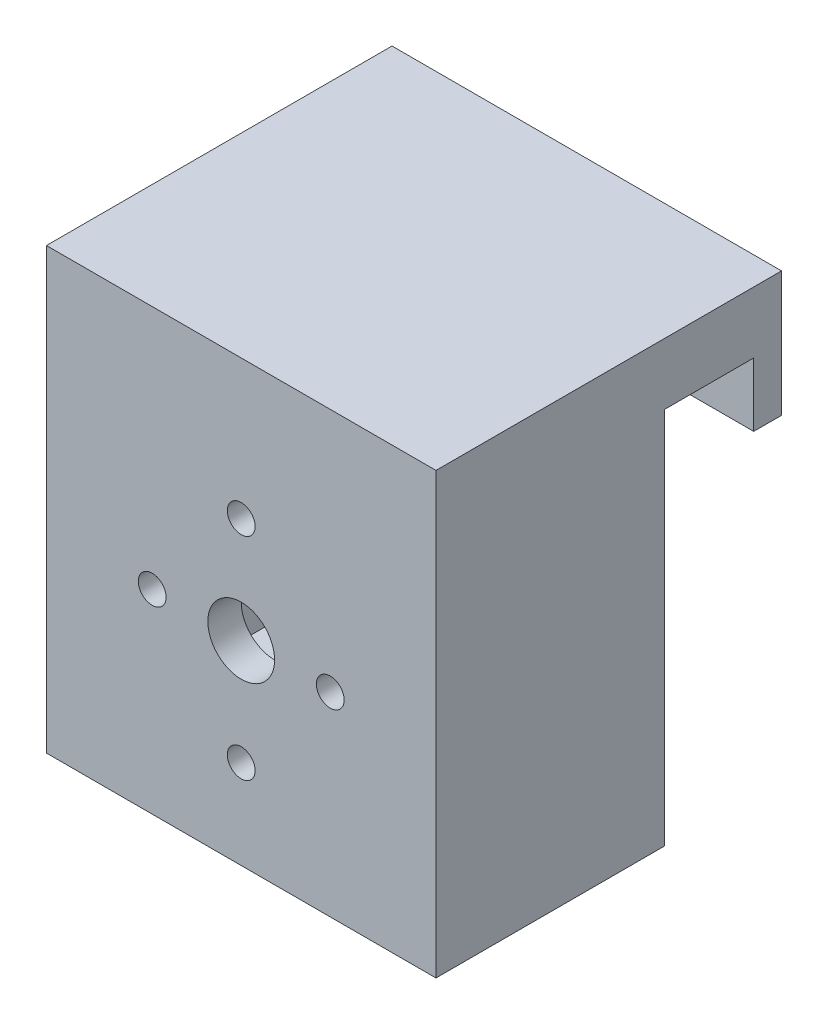
ISO-10303-21;
HEADER;
FILE_DESCRIPTION(('STEP AP214'),'2;1');
FILE_NAME('part.step','',(''),(''),'','','');
FILE_SCHEMA(('AUTOMOTIVE_DESIGN { 1 0 10303 214 1 1 1 1 }'));
ENDSEC;
DATA;
#1=APPLICATION_CONTEXT('core data for automotive mechanical design processes');
#2=APPLICATION_PROTOCOL_DEFINITION('international standard','automotive_design',2000,#1);
#3=PRODUCT_CONTEXT('',#1,'mechanical');
#4=PRODUCT('Part','Part','',(#3));
#5=PRODUCT_RELATED_PRODUCT_CATEGORY('part','',(#4));
#6=PRODUCT_DEFINITION_FORMATION('','',#4);
#7=PRODUCT_DEFINITION_CONTEXT('part definition',#1,'design');
#8=PRODUCT_DEFINITION('design','',#6,#7);
#9=PRODUCT_DEFINITION_SHAPE('','',#8);
#10=(LENGTH_UNIT() NAMED_UNIT(*) SI_UNIT(.MILLI.,.METRE.));
#11=(NAMED_UNIT(*) PLANE_ANGLE_UNIT() SI_UNIT($,.RADIAN.));
#12=(NAMED_UNIT(*) SI_UNIT($,.STERADIAN.) SOLID_ANGLE_UNIT());
#13=UNCERTAINTY_MEASURE_WITH_UNIT(LENGTH_MEASURE(1.E-05),#10,'distance_accuracy_value','');
#14=(GEOMETRIC_REPRESENTATION_CONTEXT(3) GLOBAL_UNCERTAINTY_ASSIGNED_CONTEXT((#13)) GLOBAL_UNIT_ASSIGNED_CONTEXT((#10,
#11,#12)) REPRESENTATION_CONTEXT('',''));
#15=CARTESIAN_POINT('',(0.,0.,0.));
#16=DIRECTION('',(0.,0.,1.));
#17=DIRECTION('',(1.,0.,0.));
#18=AXIS2_PLACEMENT_3D('',#15,#16,#17);
#19=CARTESIAN_POINT('',(0.,0.,3.));
#20=DIRECTION('',(0.,0.,1.));
#21=DIRECTION('',(1.,0.,0.));
#22=AXIS2_PLACEMENT_3D('',#19,#20,#21);
#23=PLANE('',#22);
#24=CARTESIAN_POINT('',(-8.,0.,3.));
#25=DIRECTION('',(0.,0.,1.));
#26=DIRECTION('',(1.,0.,0.));
#27=AXIS2_PLACEMENT_3D('',#24,#25,#26);
#28=CIRCLE('',#27,1.25);
#29=CARTESIAN_POINT('',(-6.75,0.,3.));
#30=VERTEX_POINT('',#29);
#31=EDGE_CURVE('E316',#30,#30,#28,.T.);
#32=ORIENTED_EDGE('',*,*,#31,.F.);
#33=EDGE_LOOP('',(#32));
#34=FACE_BOUND('',#33,.T.);
#35=CARTESIAN_POINT('',(0.,9.5,3.));
#36=DIRECTION('',(0.,0.,1.));
#37=DIRECTION('',(1.,0.,0.));
#38=AXIS2_PLACEMENT_3D('',#35,#36,#37);
#39=CIRCLE('',#38,1.25);
#40=CARTESIAN_POINT('',(1.25,9.5,3.));
#41=VERTEX_POINT('',#40);
#42=EDGE_CURVE('E328',#41,#41,#39,.T.);
#43=ORIENTED_EDGE('',*,*,#42,.F.);
#44=EDGE_LOOP('',(#43));
#45=FACE_BOUND('',#44,.T.);
#46=CARTESIAN_POINT('',(8.,0.,3.));
#47=DIRECTION('',(0.,0.,1.));
#48=DIRECTION('',(1.,0.,0.));
#49=AXIS2_PLACEMENT_3D('',#46,#47,#48);
#50=CIRCLE('',#49,1.25);
#51=CARTESIAN_POINT('',(9.25,0.,3.));
#52=VERTEX_POINT('',#51);
#53=EDGE_CURVE('E13',#52,#52,#50,.T.);
#54=ORIENTED_EDGE('',*,*,#53,.F.);
#55=EDGE_LOOP('',(#54));
#56=FACE_BOUND('',#55,.T.);
#57=CARTESIAN_POINT('',(0.,-9.5,3.));
#58=DIRECTION('',(0.,0.,1.));
#59=DIRECTION('',(1.,0.,0.));
#60=AXIS2_PLACEMENT_3D('',#57,#58,#59);
#61=CIRCLE('',#60,1.25);
#62=CARTESIAN_POINT('',(1.25,-9.5,3.));
#63=VERTEX_POINT('',#62);
#64=EDGE_CURVE('E322',#63,#63,#61,.T.);
#65=ORIENTED_EDGE('',*,*,#64,.F.);
#66=EDGE_LOOP('',(#65));
#67=FACE_BOUND('',#66,.T.);
#68=CARTESIAN_POINT('',(0.,0.,3.));
#69=DIRECTION('',(0.,0.,1.));
#70=DIRECTION('',(1.,0.,0.));
#71=AXIS2_PLACEMENT_3D('',#68,#69,#70);
#72=CIRCLE('',#71,3.);
#73=CARTESIAN_POINT('',(3.,0.,3.));
#74=VERTEX_POINT('',#73);
#75=EDGE_CURVE('E310',#74,#74,#72,.T.);
#76=ORIENTED_EDGE('',*,*,#75,.F.);
#77=EDGE_LOOP('',(#76));
#78=FACE_BOUND('',#77,.T.);
#79=DIRECTION('',(0.,-1.,0.));
#80=VECTOR('',#79,1.);
#81=CARTESIAN_POINT('',(-17.5,22.,3.));
#82=LINE('',#81,#80);
#83=CARTESIAN_POINT('',(-17.5,22.,3.));
#84=VERTEX_POINT('',#83);
#85=CARTESIAN_POINT('',(-17.5,-17.5,3.));
#86=VERTEX_POINT('',#85);
#87=EDGE_CURVE('E259',#84,#86,#82,.T.);
#88=ORIENTED_EDGE('',*,*,#87,.T.);
#89=DIRECTION('',(1.,0.,0.));
#90=VECTOR('',#89,1.);
#91=CARTESIAN_POINT('',(17.5,-17.5,3.));
#92=LINE('',#91,#90);
#93=CARTESIAN_POINT('',(17.5,-17.5,3.));
#94=VERTEX_POINT('',#93);
#95=EDGE_CURVE('E284',#86,#94,#92,.T.);
#96=ORIENTED_EDGE('',*,*,#95,.T.);
#97=DIRECTION('',(0.,1.,0.));
#98=VECTOR('',#97,1.);
#99=CARTESIAN_POINT('',(17.5,22.,3.));
#100=LINE('',#99,#98);
#101=CARTESIAN_POINT('',(17.5,22.,3.));
#102=VERTEX_POINT('',#101);
#103=EDGE_CURVE('E287',#94,#102,#100,.T.);
#104=ORIENTED_EDGE('',*,*,#103,.T.);
#105=DIRECTION('',(-1.,0.,0.));
#106=VECTOR('',#105,1.);
#107=CARTESIAN_POINT('',(17.5,22.,3.));
#108=LINE('',#107,#106);
#109=EDGE_CURVE('E275',#102,#84,#108,.T.);
#110=ORIENTED_EDGE('',*,*,#109,.T.);
#111=EDGE_LOOP('',(#88,#96,#104,#110));
#112=FACE_BOUND('',#111,.T.);
#113=ADVANCED_FACE('F41',(#34,#45,#56,#67,#78,#112),#23,.T.);
#114=CARTESIAN_POINT('',(0.,0.,0.));
#115=DIRECTION('',(0.,0.,1.));
#116=DIRECTION('',(1.,0.,0.));
#117=AXIS2_PLACEMENT_3D('',#114,#115,#116);
#118=PLANE('',#117);
#119=CARTESIAN_POINT('',(8.,0.,0.));
#120=DIRECTION('',(0.,0.,1.));
#121=DIRECTION('',(1.,0.,0.));
#122=AXIS2_PLACEMENT_3D('',#119,#120,#121);
#123=CIRCLE('',#122,1.25);
#124=CARTESIAN_POINT('',(9.25,0.,0.));
#125=VERTEX_POINT('',#124);
#126=EDGE_CURVE('E50',#125,#125,#123,.T.);
#127=ORIENTED_EDGE('',*,*,#126,.T.);
#128=EDGE_LOOP('',(#127));
#129=FACE_BOUND('',#128,.T.);
#130=CARTESIAN_POINT('',(0.,9.5,0.));
#131=DIRECTION('',(0.,0.,1.));
#132=DIRECTION('',(1.,0.,0.));
#133=AXIS2_PLACEMENT_3D('',#130,#131,#132);
#134=CIRCLE('',#133,1.25);
#135=CARTESIAN_POINT('',(1.25,9.5,0.));
#136=VERTEX_POINT('',#135);
#137=EDGE_CURVE('E325',#136,#136,#134,.T.);
#138=ORIENTED_EDGE('',*,*,#137,.T.);
#139=EDGE_LOOP('',(#138));
#140=FACE_BOUND('',#139,.T.);
#141=CARTESIAN_POINT('',(0.,-9.5,0.));
#142=DIRECTION('',(0.,0.,1.));
#143=DIRECTION('',(1.,0.,0.));
#144=AXIS2_PLACEMENT_3D('',#141,#142,#143);
#145=CIRCLE('',#144,1.25);
#146=CARTESIAN_POINT('',(1.25,-9.5,0.));
#147=VERTEX_POINT('',#146);
#148=EDGE_CURVE('E319',#147,#147,#145,.T.);
#149=ORIENTED_EDGE('',*,*,#148,.T.);
#150=EDGE_LOOP('',(#149));
#151=FACE_BOUND('',#150,.T.);
#152=CARTESIAN_POINT('',(-8.,0.,0.));
#153=DIRECTION('',(0.,0.,1.));
#154=DIRECTION('',(1.,0.,0.));
#155=AXIS2_PLACEMENT_3D('',#152,#153,#154);
#156=CIRCLE('',#155,1.25);
#157=CARTESIAN_POINT('',(-6.75,0.,0.));
#158=VERTEX_POINT('',#157);
#159=EDGE_CURVE('E313',#158,#158,#156,.T.);
#160=ORIENTED_EDGE('',*,*,#159,.T.);
#161=EDGE_LOOP('',(#160));
#162=FACE_BOUND('',#161,.T.);
#163=CARTESIAN_POINT('',(0.,0.,0.));
#164=DIRECTION('',(0.,0.,1.));
#165=DIRECTION('',(1.,0.,0.));
#166=AXIS2_PLACEMENT_3D('',#163,#164,#165);
#167=CIRCLE('',#166,3.);
#168=CARTESIAN_POINT('',(3.,0.,0.));
#169=VERTEX_POINT('',#168);
#170=EDGE_CURVE('E309',#169,#169,#167,.T.);
#171=ORIENTED_EDGE('',*,*,#170,.T.);
#172=EDGE_LOOP('',(#171));
#173=FACE_BOUND('',#172,.T.);
#174=DIRECTION('',(-1.,0.,0.));
#175=VECTOR('',#174,1.);
#176=CARTESIAN_POINT('',(0.,15.,0.));
#177=LINE('',#176,#175);
#178=CARTESIAN_POINT('',(15.,15.,0.));
#179=VERTEX_POINT('',#178);
#180=CARTESIAN_POINT('',(-15.,15.,0.));
#181=VERTEX_POINT('',#180);
#182=EDGE_CURVE('E294',#179,#181,#177,.T.);
#183=ORIENTED_EDGE('',*,*,#182,.F.);
#184=DIRECTION('',(0.,-1.,0.));
#185=VECTOR('',#184,1.);
#186=CARTESIAN_POINT('',(15.,0.,0.));
#187=LINE('',#186,#185);
#188=CARTESIAN_POINT('',(15.,-15.,0.));
#189=VERTEX_POINT('',#188);
#190=EDGE_CURVE('E306',#179,#189,#187,.T.);
#191=ORIENTED_EDGE('',*,*,#190,.T.);
#192=DIRECTION('',(-1.,0.,0.));
#193=VECTOR('',#192,1.);
#194=CARTESIAN_POINT('',(0.,-15.,0.));
#195=LINE('',#194,#193);
#196=CARTESIAN_POINT('',(-15.,-15.,0.));
#197=VERTEX_POINT('',#196);
#198=EDGE_CURVE('E303',#189,#197,#195,.T.);
#199=ORIENTED_EDGE('',*,*,#198,.T.);
#200=DIRECTION('',(0.,-1.,0.));
#201=VECTOR('',#200,1.);
#202=CARTESIAN_POINT('',(-15.,0.,0.));
#203=LINE('',#202,#201);
#204=EDGE_CURVE('E301',#181,#197,#203,.T.);
#205=ORIENTED_EDGE('',*,*,#204,.F.);
#206=EDGE_LOOP('',(#183,#191,#199,#205));
#207=FACE_BOUND('',#206,.T.);
#208=ADVANCED_FACE('F43',(#129,#140,#151,#162,#173,#207),#118,.F.);
#209=CARTESIAN_POINT('',(8.,0.,3.));
#210=DIRECTION('',(0.,0.,-1.));
#211=DIRECTION('',(-1.,0.,0.));
#212=AXIS2_PLACEMENT_3D('',#209,#210,#211);
#213=CYLINDRICAL_SURFACE('',#212,1.25);
#214=ORIENTED_EDGE('',*,*,#53,.T.);
#215=EDGE_LOOP('',(#214));
#216=FACE_BOUND('',#215,.T.);
#217=ORIENTED_EDGE('',*,*,#126,.F.);
#218=EDGE_LOOP('',(#217));
#219=FACE_BOUND('',#218,.T.);
#220=ADVANCED_FACE('F339',(#216,#219),#213,.F.);
#221=CARTESIAN_POINT('',(0.,9.5,3.));
#222=DIRECTION('',(0.,0.,-1.));
#223=DIRECTION('',(-1.,0.,0.));
#224=AXIS2_PLACEMENT_3D('',#221,#222,#223);
#225=CYLINDRICAL_SURFACE('',#224,1.25);
#226=ORIENTED_EDGE('',*,*,#42,.T.);
#227=EDGE_LOOP('',(#226));
#228=FACE_BOUND('',#227,.T.);
#229=ORIENTED_EDGE('',*,*,#137,.F.);
#230=EDGE_LOOP('',(#229));
#231=FACE_BOUND('',#230,.T.);
#232=ADVANCED_FACE('F336',(#228,#231),#225,.F.);
#233=CARTESIAN_POINT('',(0.,-9.5,3.));
#234=DIRECTION('',(0.,0.,-1.));
#235=DIRECTION('',(-1.,0.,0.));
#236=AXIS2_PLACEMENT_3D('',#233,#234,#235);
#237=CYLINDRICAL_SURFACE('',#236,1.25);
#238=ORIENTED_EDGE('',*,*,#64,.T.);
#239=EDGE_LOOP('',(#238));
#240=FACE_BOUND('',#239,.T.);
#241=ORIENTED_EDGE('',*,*,#148,.F.);
#242=EDGE_LOOP('',(#241));
#243=FACE_BOUND('',#242,.T.);
#244=ADVANCED_FACE('F338',(#240,#243),#237,.F.);
#245=CARTESIAN_POINT('',(-8.,0.,3.));
#246=DIRECTION('',(0.,0.,-1.));
#247=DIRECTION('',(-1.,0.,0.));
#248=AXIS2_PLACEMENT_3D('',#245,#246,#247);
#249=CYLINDRICAL_SURFACE('',#248,1.25);
#250=ORIENTED_EDGE('',*,*,#31,.T.);
#251=EDGE_LOOP('',(#250));
#252=FACE_BOUND('',#251,.T.);
#253=ORIENTED_EDGE('',*,*,#159,.F.);
#254=EDGE_LOOP('',(#253));
#255=FACE_BOUND('',#254,.T.);
#256=ADVANCED_FACE('F346',(#252,#255),#249,.F.);
#257=CARTESIAN_POINT('',(0.,0.,3.));
#258=DIRECTION('',(0.,0.,-1.));
#259=DIRECTION('',(-1.,0.,0.));
#260=AXIS2_PLACEMENT_3D('',#257,#258,#259);
#261=CYLINDRICAL_SURFACE('',#260,3.);
#262=ORIENTED_EDGE('',*,*,#75,.T.);
#263=EDGE_LOOP('',(#262));
#264=FACE_BOUND('',#263,.T.);
#265=ORIENTED_EDGE('',*,*,#170,.F.);
#266=EDGE_LOOP('',(#265));
#267=FACE_BOUND('',#266,.T.);
#268=ADVANCED_FACE('F427',(#264,#267),#261,.F.);
#269=CARTESIAN_POINT('',(-15.,15.,-17.55));
#270=DIRECTION('',(-1.,0.,0.));
#271=DIRECTION('',(0.,0.,1.));
#272=AXIS2_PLACEMENT_3D('',#269,#270,#271);
#273=PLANE('',#272);
#274=DIRECTION('',(0.,0.,1.));
#275=VECTOR('',#274,1.);
#276=CARTESIAN_POINT('',(-15.,15.,-17.55));
#277=LINE('',#276,#275);
#278=CARTESIAN_POINT('',(-15.,15.,-17.5500000000114));
#279=VERTEX_POINT('',#278);
#280=EDGE_CURVE('E256',#279,#181,#277,.T.);
#281=ORIENTED_EDGE('',*,*,#280,.T.);
#282=ORIENTED_EDGE('',*,*,#204,.T.);
#283=DIRECTION('',(0.,0.,1.));
#284=VECTOR('',#283,1.);
#285=CARTESIAN_POINT('',(-15.,-15.,-17.55));
#286=LINE('',#285,#284);
#287=CARTESIAN_POINT('',(-15.,-15.,-17.55));
#288=VERTEX_POINT('',#287);
#289=EDGE_CURVE('E66',#288,#197,#286,.T.);
#290=ORIENTED_EDGE('',*,*,#289,.F.);
#291=DIRECTION('',(0.,-1.,0.));
#292=VECTOR('',#291,1.);
#293=CARTESIAN_POINT('',(-15.,15.,-17.55));
#294=LINE('',#293,#292);
#295=EDGE_CURVE('E246',#279,#288,#294,.T.);
#296=ORIENTED_EDGE('',*,*,#295,.F.);
#297=EDGE_LOOP('',(#281,#282,#290,#296));
#298=FACE_BOUND('',#297,.T.);
#299=ADVANCED_FACE('F418',(#298),#273,.F.);
#300=CARTESIAN_POINT('',(15.,15.,-17.55));
#301=DIRECTION('',(1.,0.,0.));
#302=DIRECTION('',(0.,0.,-1.));
#303=AXIS2_PLACEMENT_3D('',#300,#301,#302);
#304=PLANE('',#303);
#305=DIRECTION('',(0.,0.,1.));
#306=VECTOR('',#305,1.);
#307=CARTESIAN_POINT('',(15.,-15.,-17.55));
#308=LINE('',#307,#306);
#309=CARTESIAN_POINT('',(15.,-15.,-17.55));
#310=VERTEX_POINT('',#309);
#311=EDGE_CURVE('E263',#310,#189,#308,.T.);
#312=ORIENTED_EDGE('',*,*,#311,.T.);
#313=ORIENTED_EDGE('',*,*,#190,.F.);
#314=DIRECTION('',(0.,0.,1.));
#315=VECTOR('',#314,1.);
#316=CARTESIAN_POINT('',(15.,15.,-17.55));
#317=LINE('',#316,#315);
#318=CARTESIAN_POINT('',(15.,15.,-17.5500000000114));
#319=VERTEX_POINT('',#318);
#320=EDGE_CURVE('E260',#319,#179,#317,.T.);
#321=ORIENTED_EDGE('',*,*,#320,.F.);
#322=DIRECTION('',(0.,1.,0.));
#323=VECTOR('',#322,1.);
#324=CARTESIAN_POINT('',(15.,15.,-17.55));
#325=LINE('',#324,#323);
#326=EDGE_CURVE('E252',#310,#319,#325,.T.);
#327=ORIENTED_EDGE('',*,*,#326,.F.);
#328=EDGE_LOOP('',(#312,#313,#321,#327));
#329=FACE_BOUND('',#328,.T.);
#330=ADVANCED_FACE('F452',(#329),#304,.F.);
#331=CARTESIAN_POINT('',(15.,15.,-17.55));
#332=DIRECTION('',(0.,1.,0.));
#333=DIRECTION('',(0.,0.,1.));
#334=AXIS2_PLACEMENT_3D('',#331,#332,#333);
#335=PLANE('',#334);
#336=ORIENTED_EDGE('',*,*,#320,.T.);
#337=ORIENTED_EDGE('',*,*,#182,.T.);
#338=ORIENTED_EDGE('',*,*,#280,.F.);
#339=DIRECTION('',(-1.,0.,0.));
#340=VECTOR('',#339,1.);
#341=CARTESIAN_POINT('',(15.,15.,-17.55));
#342=LINE('',#341,#340);
#343=EDGE_CURVE('E254',#319,#279,#342,.T.);
#344=ORIENTED_EDGE('',*,*,#343,.F.);
#345=EDGE_LOOP('',(#336,#337,#338,#344));
#346=FACE_BOUND('',#345,.T.);
#347=ADVANCED_FACE('F445',(#346),#335,.F.);
#348=CARTESIAN_POINT('',(15.,-15.,-17.55));
#349=DIRECTION('',(0.,-1.,0.));
#350=DIRECTION('',(0.,0.,-1.));
#351=AXIS2_PLACEMENT_3D('',#348,#349,#350);
#352=PLANE('',#351);
#353=ORIENTED_EDGE('',*,*,#289,.T.);
#354=ORIENTED_EDGE('',*,*,#198,.F.);
#355=ORIENTED_EDGE('',*,*,#311,.F.);
#356=DIRECTION('',(1.,0.,0.));
#357=VECTOR('',#356,1.);
#358=CARTESIAN_POINT('',(15.,-15.,-17.55));
#359=LINE('',#358,#357);
#360=EDGE_CURVE('E248',#288,#310,#359,.T.);
#361=ORIENTED_EDGE('',*,*,#360,.F.);
#362=EDGE_LOOP('',(#353,#354,#355,#361));
#363=FACE_BOUND('',#362,.T.);
#364=ADVANCED_FACE('F426',(#363),#352,.F.);
#365=CARTESIAN_POINT('',(-17.5,22.,-17.55));
#366=DIRECTION('',(-1.,0.,0.));
#367=DIRECTION('',(0.,0.,1.));
#368=AXIS2_PLACEMENT_3D('',#365,#366,#367);
#369=PLANE('',#368);
#370=DIRECTION('',(0.,1.,2.68582755974829E-12));
#371=VECTOR('',#370,1.);
#372=CARTESIAN_POINT('',(-17.5,6.86228941517289E-11,-25.5500000000596));
#373=LINE('',#372,#371);
#374=CARTESIAN_POINT('',(-17.5,10.757666378419,-25.550000000023));
#375=VERTEX_POINT('',#374);
#376=CARTESIAN_POINT('',(-17.5,16.4750000000853,-25.5500000000154));
#377=VERTEX_POINT('',#376);
#378=EDGE_CURVE('E219',#375,#377,#373,.T.);
#379=ORIENTED_EDGE('',*,*,#378,.T.);
#380=DIRECTION('',(0.,0.,-1.));
#381=VECTOR('',#380,1.);
#382=CARTESIAN_POINT('',(-17.5,16.4750000000853,0.));
#383=LINE('',#382,#381);
#384=CARTESIAN_POINT('',(-17.5,16.4750000000853,-17.5500000000154));
#385=VERTEX_POINT('',#384);
#386=EDGE_CURVE('E216',#385,#377,#383,.T.);
#387=ORIENTED_EDGE('',*,*,#386,.F.);
#388=DIRECTION('',(0.,-1.,0.));
#389=VECTOR('',#388,1.);
#390=CARTESIAN_POINT('',(-17.5,22.,-17.55));
#391=LINE('',#390,#389);
#392=CARTESIAN_POINT('',(-17.5,-17.5,-17.55));
#393=VERTEX_POINT('',#392);
#394=EDGE_CURVE('E272',#385,#393,#391,.T.);
#395=ORIENTED_EDGE('',*,*,#394,.T.);
#396=DIRECTION('',(0.,0.,1.));
#397=VECTOR('',#396,1.);
#398=CARTESIAN_POINT('',(-17.5,-17.5,-17.55));
#399=LINE('',#398,#397);
#400=EDGE_CURVE('E278',#393,#86,#399,.T.);
#401=ORIENTED_EDGE('',*,*,#400,.T.);
#402=ORIENTED_EDGE('',*,*,#87,.F.);
#403=DIRECTION('',(0.,0.,1.));
#404=VECTOR('',#403,1.);
#405=CARTESIAN_POINT('',(-17.5,22.,-17.55));
#406=LINE('',#405,#404);
#407=CARTESIAN_POINT('',(-17.5,22.,-28.05));
#408=VERTEX_POINT('',#407);
#409=EDGE_CURVE('E292',#408,#84,#406,.T.);
#410=ORIENTED_EDGE('',*,*,#409,.F.);
#411=DIRECTION('',(0.,1.,0.));
#412=VECTOR('',#411,1.);
#413=CARTESIAN_POINT('',(-17.5,22.,-28.05));
#414=LINE('',#413,#412);
#415=CARTESIAN_POINT('',(-17.5,10.757666378419,-28.05));
#416=VERTEX_POINT('',#415);
#417=EDGE_CURVE('E242',#416,#408,#414,.T.);
#418=ORIENTED_EDGE('',*,*,#417,.F.);
#419=DIRECTION('',(0.,0.,1.));
#420=VECTOR('',#419,1.);
#421=CARTESIAN_POINT('',(-17.5,10.757666378419,-28.05));
#422=LINE('',#421,#420);
#423=EDGE_CURVE('E245',#416,#375,#422,.T.);
#424=ORIENTED_EDGE('',*,*,#423,.T.);
#425=EDGE_LOOP('',(#379,#387,#395,#401,#402,#410,#418,#424));
#426=FACE_BOUND('',#425,.T.);
#427=ADVANCED_FACE('F371',(#426),#369,.T.);
#428=CARTESIAN_POINT('',(17.5,22.,-17.55));
#429=DIRECTION('',(0.,1.,0.));
#430=DIRECTION('',(-1.,0.,0.));
#431=AXIS2_PLACEMENT_3D('',#428,#429,#430);
#432=PLANE('',#431);
#433=ORIENTED_EDGE('',*,*,#109,.F.);
#434=DIRECTION('',(0.,0.,1.));
#435=VECTOR('',#434,1.);
#436=CARTESIAN_POINT('',(17.5,22.,-17.55));
#437=LINE('',#436,#435);
#438=CARTESIAN_POINT('',(17.5,22.,-28.05));
#439=VERTEX_POINT('',#438);
#440=EDGE_CURVE('E295',#439,#102,#437,.T.);
#441=ORIENTED_EDGE('',*,*,#440,.F.);
#442=DIRECTION('',(1.,0.,0.));
#443=VECTOR('',#442,1.);
#444=CARTESIAN_POINT('',(17.5,22.,-28.05));
#445=LINE('',#444,#443);
#446=EDGE_CURVE('E231',#408,#439,#445,.T.);
#447=ORIENTED_EDGE('',*,*,#446,.F.);
#448=ORIENTED_EDGE('',*,*,#409,.T.);
#449=EDGE_LOOP('',(#433,#441,#447,#448));
#450=FACE_BOUND('',#449,.T.);
#451=ADVANCED_FACE('F386',(#450),#432,.T.);
#452=CARTESIAN_POINT('',(17.5,22.,-17.55));
#453=DIRECTION('',(1.,0.,0.));
#454=DIRECTION('',(0.,0.,-1.));
#455=AXIS2_PLACEMENT_3D('',#452,#453,#454);
#456=PLANE('',#455);
#457=DIRECTION('',(0.,1.,2.68582755974829E-12));
#458=VECTOR('',#457,1.);
#459=CARTESIAN_POINT('',(17.5,6.86228941517289E-11,-25.5500000000596));
#460=LINE('',#459,#458);
#461=CARTESIAN_POINT('',(17.5,10.757666378419,-25.550000000023));
#462=VERTEX_POINT('',#461);
#463=CARTESIAN_POINT('',(17.5,16.4750000000853,-25.5500000000154));
#464=VERTEX_POINT('',#463);
#465=EDGE_CURVE('E225',#462,#464,#460,.T.);
#466=ORIENTED_EDGE('',*,*,#465,.F.);
#467=DIRECTION('',(0.,0.,1.));
#468=VECTOR('',#467,1.);
#469=CARTESIAN_POINT('',(17.5,10.757666378419,-28.05));
#470=LINE('',#469,#468);
#471=CARTESIAN_POINT('',(17.5,10.757666378419,-28.05));
#472=VERTEX_POINT('',#471);
#473=EDGE_CURVE('E249',#472,#462,#470,.T.);
#474=ORIENTED_EDGE('',*,*,#473,.F.);
#475=DIRECTION('',(0.,-1.,0.));
#476=VECTOR('',#475,1.);
#477=CARTESIAN_POINT('',(17.5,10.757666378419,-28.05));
#478=LINE('',#477,#476);
#479=EDGE_CURVE('E238',#439,#472,#478,.T.);
#480=ORIENTED_EDGE('',*,*,#479,.F.);
#481=ORIENTED_EDGE('',*,*,#440,.T.);
#482=ORIENTED_EDGE('',*,*,#103,.F.);
#483=DIRECTION('',(0.,0.,1.));
#484=VECTOR('',#483,1.);
#485=CARTESIAN_POINT('',(17.5,-17.5,-17.55));
#486=LINE('',#485,#484);
#487=CARTESIAN_POINT('',(17.5,-17.5,-17.55));
#488=VERTEX_POINT('',#487);
#489=EDGE_CURVE('E297',#488,#94,#486,.T.);
#490=ORIENTED_EDGE('',*,*,#489,.F.);
#491=DIRECTION('',(0.,1.,0.));
#492=VECTOR('',#491,1.);
#493=CARTESIAN_POINT('',(17.5,22.,-17.55));
#494=LINE('',#493,#492);
#495=CARTESIAN_POINT('',(17.5,16.4750000000853,-17.5500000000154));
#496=VERTEX_POINT('',#495);
#497=EDGE_CURVE('E276',#488,#496,#494,.T.);
#498=ORIENTED_EDGE('',*,*,#497,.T.);
#499=DIRECTION('',(0.,0.,-1.));
#500=VECTOR('',#499,1.);
#501=CARTESIAN_POINT('',(17.5,16.4750000000853,0.));
#502=LINE('',#501,#500);
#503=EDGE_CURVE('E222',#496,#464,#502,.T.);
#504=ORIENTED_EDGE('',*,*,#503,.T.);
#505=EDGE_LOOP('',(#466,#474,#480,#481,#482,#490,#498,#504));
#506=FACE_BOUND('',#505,.T.);
#507=ADVANCED_FACE('F383',(#506),#456,.T.);
#508=CARTESIAN_POINT('',(17.5,-17.5,-17.55));
#509=DIRECTION('',(0.,-1.,0.));
#510=DIRECTION('',(0.,0.,-1.));
#511=AXIS2_PLACEMENT_3D('',#508,#509,#510);
#512=PLANE('',#511);
#513=ORIENTED_EDGE('',*,*,#95,.F.);
#514=ORIENTED_EDGE('',*,*,#400,.F.);
#515=DIRECTION('',(1.,0.,0.));
#516=VECTOR('',#515,1.);
#517=CARTESIAN_POINT('',(17.5,-17.5,-17.55));
#518=LINE('',#517,#516);
#519=EDGE_CURVE('E269',#393,#488,#518,.T.);
#520=ORIENTED_EDGE('',*,*,#519,.T.);
#521=ORIENTED_EDGE('',*,*,#489,.T.);
#522=EDGE_LOOP('',(#513,#514,#520,#521));
#523=FACE_BOUND('',#522,.T.);
#524=ADVANCED_FACE('F378',(#523),#512,.T.);
#525=CARTESIAN_POINT('',(0.,0.,-17.55));
#526=DIRECTION('',(0.,0.,-1.));
#527=DIRECTION('',(-1.,0.,0.));
#528=AXIS2_PLACEMENT_3D('',#525,#526,#527);
#529=PLANE('',#528);
#530=ORIENTED_EDGE('',*,*,#326,.T.);
#531=ORIENTED_EDGE('',*,*,#343,.T.);
#532=ORIENTED_EDGE('',*,*,#295,.T.);
#533=ORIENTED_EDGE('',*,*,#360,.T.);
#534=EDGE_LOOP('',(#530,#531,#532,#533));
#535=FACE_BOUND('',#534,.T.);
#536=DIRECTION('',(1.,0.,0.));
#537=VECTOR('',#536,1.);
#538=CARTESIAN_POINT('',(-17.50105,16.4750000000853,-17.5500000000154));
#539=LINE('',#538,#537);
#540=EDGE_CURVE('E228',#385,#496,#539,.T.);
#541=ORIENTED_EDGE('',*,*,#540,.T.);
#542=ORIENTED_EDGE('',*,*,#497,.F.);
#543=ORIENTED_EDGE('',*,*,#519,.F.);
#544=ORIENTED_EDGE('',*,*,#394,.F.);
#545=EDGE_LOOP('',(#541,#542,#543,#544));
#546=FACE_BOUND('',#545,.T.);
#547=ADVANCED_FACE('F406',(#535,#546),#529,.T.);
#548=CARTESIAN_POINT('',(-17.5,10.757666378419,-28.05));
#549=DIRECTION('',(0.,1.,0.));
#550=DIRECTION('',(0.,0.,1.));
#551=AXIS2_PLACEMENT_3D('',#548,#549,#550);
#552=PLANE('',#551);
#553=ORIENTED_EDGE('',*,*,#473,.T.);
#554=DIRECTION('',(1.,0.,0.));
#555=VECTOR('',#554,1.);
#556=CARTESIAN_POINT('',(-17.50105,10.757666378419,-25.550000000023));
#557=LINE('',#556,#555);
#558=EDGE_CURVE('E232',#375,#462,#557,.T.);
#559=ORIENTED_EDGE('',*,*,#558,.F.);
#560=ORIENTED_EDGE('',*,*,#423,.F.);
#561=DIRECTION('',(-1.,0.,0.));
#562=VECTOR('',#561,1.);
#563=CARTESIAN_POINT('',(-17.5,10.757666378419,-28.05));
#564=LINE('',#563,#562);
#565=EDGE_CURVE('E240',#472,#416,#564,.T.);
#566=ORIENTED_EDGE('',*,*,#565,.F.);
#567=EDGE_LOOP('',(#553,#559,#560,#566));
#568=FACE_BOUND('',#567,.T.);
#569=ADVANCED_FACE('F398',(#568),#552,.F.);
#570=CARTESIAN_POINT('',(0.,0.,-28.05));
#571=DIRECTION('',(0.,0.,1.));
#572=DIRECTION('',(1.,0.,0.));
#573=AXIS2_PLACEMENT_3D('',#570,#571,#572);
#574=PLANE('',#573);
#575=ORIENTED_EDGE('',*,*,#446,.T.);
#576=ORIENTED_EDGE('',*,*,#479,.T.);
#577=ORIENTED_EDGE('',*,*,#565,.T.);
#578=ORIENTED_EDGE('',*,*,#417,.T.);
#579=EDGE_LOOP('',(#575,#576,#577,#578));
#580=FACE_BOUND('',#579,.T.);
#581=ADVANCED_FACE('F389',(#580),#574,.F.);
#582=CARTESIAN_POINT('',(-17.50105,16.4750000000853,0.));
#583=DIRECTION('',(0.,-1.,0.));
#584=DIRECTION('',(0.,0.,-1.));
#585=AXIS2_PLACEMENT_3D('',#582,#583,#584);
#586=PLANE('',#585);
#587=DIRECTION('',(1.,0.,0.));
#588=VECTOR('',#587,1.);
#589=CARTESIAN_POINT('',(-22.2434164902255,16.4750000000853,-19.3000000000276));
#590=LINE('',#589,#588);
#591=CARTESIAN_POINT('',(-15.5,16.4750000000853,-19.3000000000276));
#592=VERTEX_POINT('',#591);
#593=CARTESIAN_POINT('',(15.5,16.4750000000853,-19.3000000000276));
#594=VERTEX_POINT('',#593);
#595=EDGE_CURVE('E203',#592,#594,#590,.T.);
#596=ORIENTED_EDGE('',*,*,#595,.T.);
#597=DIRECTION('',(0.,0.,-1.));
#598=VECTOR('',#597,1.);
#599=CARTESIAN_POINT('',(15.5,16.4750000000853,0.));
#600=LINE('',#599,#598);
#601=CARTESIAN_POINT('',(15.5,16.4750000000853,-23.8000000000031));
#602=VERTEX_POINT('',#601);
#603=EDGE_CURVE('E191',#594,#602,#600,.T.);
#604=ORIENTED_EDGE('',*,*,#603,.T.);
#605=DIRECTION('',(1.,0.,0.));
#606=VECTOR('',#605,1.);
#607=CARTESIAN_POINT('',(-22.2434164902255,16.4750000000853,-23.8000000000031));
#608=LINE('',#607,#606);
#609=CARTESIAN_POINT('',(-15.5,16.4750000000853,-23.8000000000031));
#610=VERTEX_POINT('',#609);
#611=EDGE_CURVE('E202',#610,#602,#608,.T.);
#612=ORIENTED_EDGE('',*,*,#611,.F.);
#613=DIRECTION('',(0.,0.,-1.));
#614=VECTOR('',#613,1.);
#615=CARTESIAN_POINT('',(-15.5,16.4750000000853,0.));
#616=LINE('',#615,#614);
#617=EDGE_CURVE('E58',#592,#610,#616,.T.);
#618=ORIENTED_EDGE('',*,*,#617,.F.);
#619=EDGE_LOOP('',(#596,#604,#612,#618));
#620=FACE_BOUND('',#619,.T.);
#621=ORIENTED_EDGE('',*,*,#386,.T.);
#622=DIRECTION('',(1.,0.,0.));
#623=VECTOR('',#622,1.);
#624=CARTESIAN_POINT('',(-17.50105,16.4750000000853,-25.5500000000154));
#625=LINE('',#624,#623);
#626=EDGE_CURVE('E229',#377,#464,#625,.T.);
#627=ORIENTED_EDGE('',*,*,#626,.T.);
#628=ORIENTED_EDGE('',*,*,#503,.F.);
#629=ORIENTED_EDGE('',*,*,#540,.F.);
#630=EDGE_LOOP('',(#621,#627,#628,#629));
#631=FACE_BOUND('',#630,.T.);
#632=ADVANCED_FACE('F404',(#620,#631),#586,.T.);
#633=CARTESIAN_POINT('',(-17.50105,6.86228941517289E-11,-25.5500000000596));
#634=DIRECTION('',(0.,2.68582755974829E-12,-1.));
#635=DIRECTION('',(0.,1.,2.68582755974829E-12));
#636=AXIS2_PLACEMENT_3D('',#633,#634,#635);
#637=PLANE('',#636);
#638=ORIENTED_EDGE('',*,*,#558,.T.);
#639=ORIENTED_EDGE('',*,*,#465,.T.);
#640=ORIENTED_EDGE('',*,*,#626,.F.);
#641=ORIENTED_EDGE('',*,*,#378,.F.);
#642=EDGE_LOOP('',(#638,#639,#640,#641));
#643=FACE_BOUND('',#642,.T.);
#644=ADVANCED_FACE('F401',(#643),#637,.F.);
#645=CARTESIAN_POINT('',(-15.5,22.,-17.55));
#646=DIRECTION('',(-1.,0.,0.));
#647=DIRECTION('',(0.,0.,1.));
#648=AXIS2_PLACEMENT_3D('',#645,#646,#647);
#649=PLANE('',#648);
#650=CARTESIAN_POINT('',(-15.5,16.9750000000853,-22.8000000000154));
#651=DIRECTION('',(-1.,0.,0.));
#652=DIRECTION('',(0.,0.,1.));
#653=AXIS2_PLACEMENT_3D('',#650,#651,#652);
#654=CIRCLE('',#653,0.999999999987784);
#655=CARTESIAN_POINT('',(-15.5,16.9750000000853,-23.8000000000031));
#656=VERTEX_POINT('',#655);
#657=CARTESIAN_POINT('',(-15.5,17.1750000000853,-21.8202041029146));
#658=VERTEX_POINT('',#657);
#659=EDGE_CURVE('E184',#656,#658,#654,.F.);
#660=ORIENTED_EDGE('',*,*,#659,.T.);
#661=DIRECTION('',(0.,0.,1.));
#662=VECTOR('',#661,1.);
#663=CARTESIAN_POINT('',(-15.5,17.1750000000853,0.));
#664=LINE('',#663,#662);
#665=CARTESIAN_POINT('',(-15.5,17.1750000000853,-21.2797958971162));
#666=VERTEX_POINT('',#665);
#667=EDGE_CURVE('E171',#658,#666,#664,.T.);
#668=ORIENTED_EDGE('',*,*,#667,.T.);
#669=CARTESIAN_POINT('',(-15.5,16.9750000000853,-20.3000000000154));
#670=DIRECTION('',(-1.,0.,0.));
#671=DIRECTION('',(0.,0.,1.));
#672=AXIS2_PLACEMENT_3D('',#669,#670,#671);
#673=CIRCLE('',#672,0.999999999987784);
#674=CARTESIAN_POINT('',(-15.5,16.9750000000853,-19.3000000000276));
#675=VERTEX_POINT('',#674);
#676=EDGE_CURVE('E207',#666,#675,#673,.F.);
#677=ORIENTED_EDGE('',*,*,#676,.T.);
#678=DIRECTION('',(0.,-1.,0.));
#679=VECTOR('',#678,1.);
#680=CARTESIAN_POINT('',(-15.5,0.,-19.3000000000276));
#681=LINE('',#680,#679);
#682=EDGE_CURVE('E204',#675,#592,#681,.T.);
#683=ORIENTED_EDGE('',*,*,#682,.T.);
#684=ORIENTED_EDGE('',*,*,#617,.T.);
#685=DIRECTION('',(0.,-1.,0.));
#686=VECTOR('',#685,1.);
#687=CARTESIAN_POINT('',(-15.5,0.,-23.8000000000031));
#688=LINE('',#687,#686);
#689=EDGE_CURVE('E189',#656,#610,#688,.T.);
#690=ORIENTED_EDGE('',*,*,#689,.F.);
#691=EDGE_LOOP('',(#660,#668,#677,#683,#684,#690));
#692=FACE_BOUND('',#691,.T.);
#693=ADVANCED_FACE('F188',(#692),#649,.F.);
#694=CARTESIAN_POINT('',(15.5,0.,0.));
#695=DIRECTION('',(1.,0.,0.));
#696=DIRECTION('',(0.,0.,-1.));
#697=AXIS2_PLACEMENT_3D('',#694,#695,#696);
#698=PLANE('',#697);
#699=DIRECTION('',(0.,-1.,0.));
#700=VECTOR('',#699,1.);
#701=CARTESIAN_POINT('',(15.5,0.,-23.8000000000031));
#702=LINE('',#701,#700);
#703=CARTESIAN_POINT('',(15.5,16.9750000000853,-23.8000000000031));
#704=VERTEX_POINT('',#703);
#705=EDGE_CURVE('E198',#704,#602,#702,.T.);
#706=ORIENTED_EDGE('',*,*,#705,.T.);
#707=ORIENTED_EDGE('',*,*,#603,.F.);
#708=DIRECTION('',(0.,-1.,0.));
#709=VECTOR('',#708,1.);
#710=CARTESIAN_POINT('',(15.5,0.,-19.3000000000276));
#711=LINE('',#710,#709);
#712=CARTESIAN_POINT('',(15.5,16.9750000000853,-19.3000000000276));
#713=VERTEX_POINT('',#712);
#714=EDGE_CURVE('E194',#713,#594,#711,.T.);
#715=ORIENTED_EDGE('',*,*,#714,.F.);
#716=CARTESIAN_POINT('',(15.5,16.9750000000853,-20.3000000000154));
#717=DIRECTION('',(1.,0.,0.));
#718=DIRECTION('',(0.,0.,-1.));
#719=AXIS2_PLACEMENT_3D('',#716,#717,#718);
#720=CIRCLE('',#719,0.999999999987784);
#721=CARTESIAN_POINT('',(15.5,17.1750000000853,-21.2797958971162));
#722=VERTEX_POINT('',#721);
#723=EDGE_CURVE('E499',#722,#713,#720,.T.);
#724=ORIENTED_EDGE('',*,*,#723,.F.);
#725=DIRECTION('',(0.,0.,1.));
#726=VECTOR('',#725,1.);
#727=CARTESIAN_POINT('',(15.5,17.1750000000853,0.));
#728=LINE('',#727,#726);
#729=CARTESIAN_POINT('',(15.5,17.1750000000853,-21.8202041029146));
#730=VERTEX_POINT('',#729);
#731=EDGE_CURVE('E501',#730,#722,#728,.T.);
#732=ORIENTED_EDGE('',*,*,#731,.F.);
#733=CARTESIAN_POINT('',(15.5,16.9750000000853,-22.8000000000154));
#734=DIRECTION('',(1.,0.,0.));
#735=DIRECTION('',(0.,0.,-1.));
#736=AXIS2_PLACEMENT_3D('',#733,#734,#735);
#737=CIRCLE('',#736,0.999999999987784);
#738=EDGE_CURVE('E186',#704,#730,#737,.T.);
#739=ORIENTED_EDGE('',*,*,#738,.F.);
#740=EDGE_LOOP('',(#706,#707,#715,#724,#732,#739));
#741=FACE_BOUND('',#740,.T.);
#742=ADVANCED_FACE('F470',(#741),#698,.F.);
#743=CARTESIAN_POINT('',(-22.2434164902255,16.9750000000853,-22.8000000000154));
#744=DIRECTION('',(1.,0.,0.));
#745=DIRECTION('',(0.,0.,-1.));
#746=AXIS2_PLACEMENT_3D('',#743,#744,#745);
#747=CYLINDRICAL_SURFACE('',#746,0.999999999987784);
#748=DIRECTION('',(1.,0.,0.));
#749=VECTOR('',#748,1.);
#750=CARTESIAN_POINT('',(-22.2434164902255,16.9750000000853,-23.8000000000031));
#751=LINE('',#750,#749);
#752=EDGE_CURVE('E210',#656,#704,#751,.T.);
#753=ORIENTED_EDGE('',*,*,#752,.T.);
#754=ORIENTED_EDGE('',*,*,#738,.T.);
#755=DIRECTION('',(1.,0.,0.));
#756=VECTOR('',#755,1.);
#757=CARTESIAN_POINT('',(-22.2434164902255,17.1750000000853,-21.8202041029146));
#758=LINE('',#757,#756);
#759=EDGE_CURVE('E175',#658,#730,#758,.T.);
#760=ORIENTED_EDGE('',*,*,#759,.F.);
#761=ORIENTED_EDGE('',*,*,#659,.F.);
#762=EDGE_LOOP('',(#753,#754,#760,#761));
#763=FACE_BOUND('',#762,.T.);
#764=ADVANCED_FACE('F183',(#763),#747,.F.);
#765=CARTESIAN_POINT('',(-22.2434164902255,17.1750000000853,0.));
#766=DIRECTION('',(0.,1.,0.));
#767=DIRECTION('',(0.,0.,1.));
#768=AXIS2_PLACEMENT_3D('',#765,#766,#767);
#769=PLANE('',#768);
#770=ORIENTED_EDGE('',*,*,#759,.T.);
#771=ORIENTED_EDGE('',*,*,#731,.T.);
#772=DIRECTION('',(1.,0.,0.));
#773=VECTOR('',#772,1.);
#774=CARTESIAN_POINT('',(-22.2434164902255,17.1750000000853,-21.2797958971162));
#775=LINE('',#774,#773);
#776=EDGE_CURVE('E177',#666,#722,#775,.T.);
#777=ORIENTED_EDGE('',*,*,#776,.F.);
#778=ORIENTED_EDGE('',*,*,#667,.F.);
#779=EDGE_LOOP('',(#770,#771,#777,#778));
#780=FACE_BOUND('',#779,.T.);
#781=ADVANCED_FACE('F173',(#780),#769,.F.);
#782=CARTESIAN_POINT('',(-22.2434164902255,16.9750000000853,-20.3000000000154));
#783=DIRECTION('',(1.,0.,0.));
#784=DIRECTION('',(0.,0.,-1.));
#785=AXIS2_PLACEMENT_3D('',#782,#783,#784);
#786=CYLINDRICAL_SURFACE('',#785,0.999999999987784);
#787=ORIENTED_EDGE('',*,*,#776,.T.);
#788=ORIENTED_EDGE('',*,*,#723,.T.);
#789=DIRECTION('',(1.,0.,0.));
#790=VECTOR('',#789,1.);
#791=CARTESIAN_POINT('',(-22.2434164902255,16.9750000000853,-19.3000000000276));
#792=LINE('',#791,#790);
#793=EDGE_CURVE('E206',#675,#713,#792,.T.);
#794=ORIENTED_EDGE('',*,*,#793,.F.);
#795=ORIENTED_EDGE('',*,*,#676,.F.);
#796=EDGE_LOOP('',(#787,#788,#794,#795));
#797=FACE_BOUND('',#796,.T.);
#798=ADVANCED_FACE('F475',(#797),#786,.F.);
#799=CARTESIAN_POINT('',(-22.2434164902255,0.,-19.3000000000276));
#800=DIRECTION('',(0.,0.,1.));
#801=DIRECTION('',(1.,0.,0.));
#802=AXIS2_PLACEMENT_3D('',#799,#800,#801);
#803=PLANE('',#802);
#804=ORIENTED_EDGE('',*,*,#793,.T.);
#805=ORIENTED_EDGE('',*,*,#714,.T.);
#806=ORIENTED_EDGE('',*,*,#595,.F.);
#807=ORIENTED_EDGE('',*,*,#682,.F.);
#808=EDGE_LOOP('',(#804,#805,#806,#807));
#809=FACE_BOUND('',#808,.T.);
#810=ADVANCED_FACE('F478',(#809),#803,.F.);
#811=CARTESIAN_POINT('',(-22.2434164902255,0.,-23.8000000000031));
#812=DIRECTION('',(0.,0.,1.));
#813=DIRECTION('',(1.,0.,0.));
#814=AXIS2_PLACEMENT_3D('',#811,#812,#813);
#815=PLANE('',#814);
#816=ORIENTED_EDGE('',*,*,#689,.T.);
#817=ORIENTED_EDGE('',*,*,#611,.T.);
#818=ORIENTED_EDGE('',*,*,#705,.F.);
#819=ORIENTED_EDGE('',*,*,#752,.F.);
#820=EDGE_LOOP('',(#816,#817,#818,#819));
#821=FACE_BOUND('',#820,.T.);
#822=ADVANCED_FACE('F482',(#821),#815,.T.);
#823=CLOSED_SHELL('',(#113,#208,#220,#232,#244,#256,#268,#299,#330,#347,#364,#427,#451,#507,
#524,#547,#569,#581,#632,#644,#693,#742,#764,#781,#798,#810,#822));
#824=MANIFOLD_SOLID_BREP('B2',#823);
#825=ADVANCED_BREP_SHAPE_REPRESENTATION('',(#18,#824),#14);
#826=SHAPE_DEFINITION_REPRESENTATION(#9,#825);
ENDSEC;
END-ISO-10303-21;
